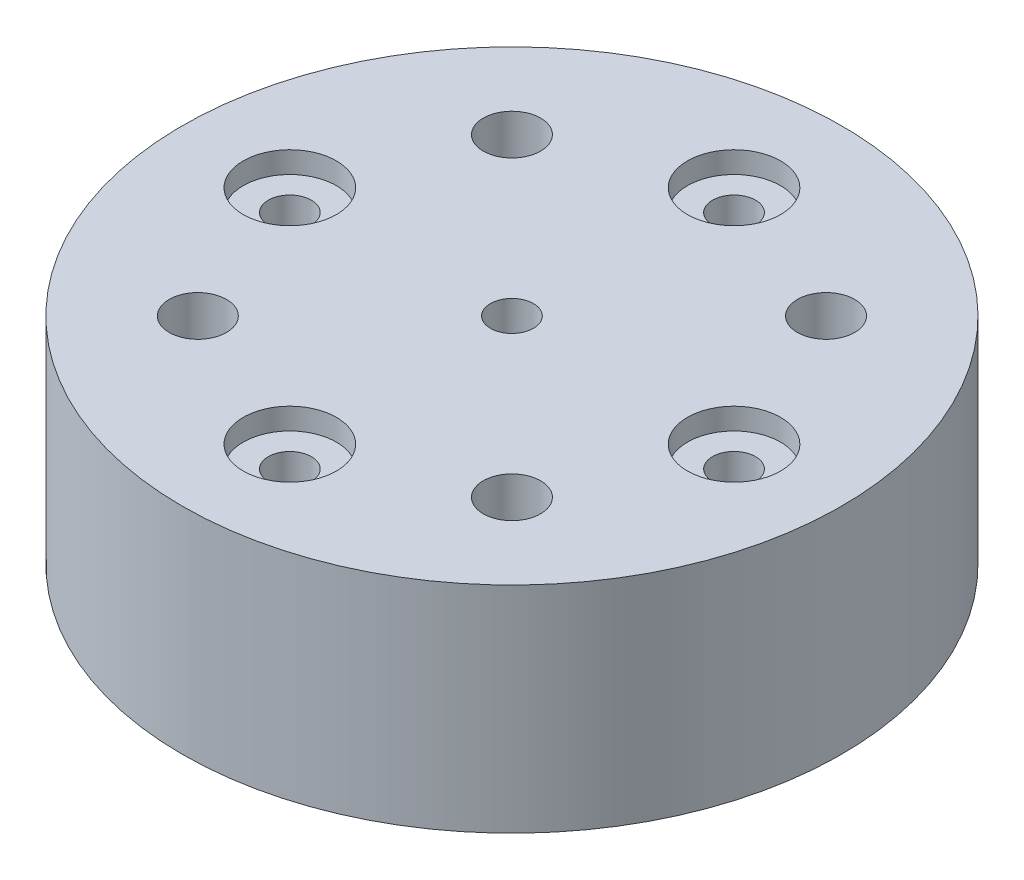
ISO-10303-21;
HEADER;
FILE_DESCRIPTION(('STEP AP214'),'2;1');
FILE_NAME('part.step','',(''),(''),'','','');
FILE_SCHEMA(('AUTOMOTIVE_DESIGN { 1 0 10303 214 1 1 1 1 }'));
ENDSEC;
DATA;
#1=APPLICATION_CONTEXT('core data for automotive mechanical design processes');
#2=APPLICATION_PROTOCOL_DEFINITION('international standard','automotive_design',2000,#1);
#3=PRODUCT_CONTEXT('',#1,'mechanical');
#4=PRODUCT('Part','Part','',(#3));
#5=PRODUCT_RELATED_PRODUCT_CATEGORY('part','',(#4));
#6=PRODUCT_DEFINITION_FORMATION('','',#4);
#7=PRODUCT_DEFINITION_CONTEXT('part definition',#1,'design');
#8=PRODUCT_DEFINITION('design','',#6,#7);
#9=PRODUCT_DEFINITION_SHAPE('','',#8);
#10=(LENGTH_UNIT() NAMED_UNIT(*) SI_UNIT(.MILLI.,.METRE.));
#11=(NAMED_UNIT(*) PLANE_ANGLE_UNIT() SI_UNIT($,.RADIAN.));
#12=(NAMED_UNIT(*) SI_UNIT($,.STERADIAN.) SOLID_ANGLE_UNIT());
#13=UNCERTAINTY_MEASURE_WITH_UNIT(LENGTH_MEASURE(1.E-05),#10,'distance_accuracy_value','');
#14=(GEOMETRIC_REPRESENTATION_CONTEXT(3) GLOBAL_UNCERTAINTY_ASSIGNED_CONTEXT((#13)) GLOBAL_UNIT_ASSIGNED_CONTEXT((#10,
#11,#12)) REPRESENTATION_CONTEXT('',''));
#15=CARTESIAN_POINT('',(0.,0.,0.));
#16=DIRECTION('',(0.,0.,1.));
#17=DIRECTION('',(1.,0.,0.));
#18=AXIS2_PLACEMENT_3D('',#15,#16,#17);
#19=CARTESIAN_POINT('',(0.,15.,-15.5));
#20=DIRECTION('',(0.,-1.,0.));
#21=DIRECTION('',(0.,0.,-1.));
#22=AXIS2_PLACEMENT_3D('',#19,#20,#21);
#23=CYLINDRICAL_SURFACE('',#22,1.5);
#24=CARTESIAN_POINT('',(0.,0.,-15.5));
#25=DIRECTION('',(0.,1.,0.));
#26=DIRECTION('',(0.,0.,1.));
#27=AXIS2_PLACEMENT_3D('',#24,#25,#26);
#28=CIRCLE('',#27,1.5);
#29=CARTESIAN_POINT('',(0.,0.,-14.));
#30=VERTEX_POINT('',#29);
#31=EDGE_CURVE('E44',#30,#30,#28,.T.);
#32=ORIENTED_EDGE('',*,*,#31,.F.);
#33=EDGE_LOOP('',(#32));
#34=FACE_BOUND('',#33,.T.);
#35=CARTESIAN_POINT('',(0.,13.5,-15.5));
#36=DIRECTION('',(0.,1.,0.));
#37=DIRECTION('',(0.,0.,1.));
#38=AXIS2_PLACEMENT_3D('',#35,#36,#37);
#39=CIRCLE('',#38,1.5);
#40=CARTESIAN_POINT('',(0.,13.5,-14.));
#41=VERTEX_POINT('',#40);
#42=EDGE_CURVE('E35',#41,#41,#39,.T.);
#43=ORIENTED_EDGE('',*,*,#42,.T.);
#44=EDGE_LOOP('',(#43));
#45=FACE_BOUND('',#44,.T.);
#46=ADVANCED_FACE('F31',(#34,#45),#23,.F.);
#47=CARTESIAN_POINT('',(15.5000000000004,15.,-4.37689192363245E-13));
#48=DIRECTION('',(0.,-1.,0.));
#49=DIRECTION('',(0.,0.,-1.));
#50=AXIS2_PLACEMENT_3D('',#47,#48,#49);
#51=CYLINDRICAL_SURFACE('',#50,1.50000000000034);
#52=CARTESIAN_POINT('',(15.5000000000004,0.,-4.37689192363245E-13));
#53=DIRECTION('',(0.,1.,0.));
#54=DIRECTION('',(0.,0.,1.));
#55=AXIS2_PLACEMENT_3D('',#52,#53,#54);
#56=CIRCLE('',#55,1.50000000000034);
#57=CARTESIAN_POINT('',(15.5000000000004,0.,1.49999999999991));
#58=VERTEX_POINT('',#57);
#59=EDGE_CURVE('E77',#58,#58,#56,.T.);
#60=ORIENTED_EDGE('',*,*,#59,.F.);
#61=EDGE_LOOP('',(#60));
#62=FACE_BOUND('',#61,.T.);
#63=CARTESIAN_POINT('',(15.5000000000004,13.5,-4.37689192363245E-13));
#64=DIRECTION('',(0.,1.,0.));
#65=DIRECTION('',(0.,0.,1.));
#66=AXIS2_PLACEMENT_3D('',#63,#64,#65);
#67=CIRCLE('',#66,1.50000000000034);
#68=CARTESIAN_POINT('',(15.5000000000004,13.5,1.49999999999991));
#69=VERTEX_POINT('',#68);
#70=EDGE_CURVE('E55',#69,#69,#67,.T.);
#71=ORIENTED_EDGE('',*,*,#70,.T.);
#72=EDGE_LOOP('',(#71));
#73=FACE_BOUND('',#72,.T.);
#74=ADVANCED_FACE('F87',(#62,#73),#51,.F.);
#75=CARTESIAN_POINT('',(8.75378384726489E-13,15.,15.5));
#76=DIRECTION('',(0.,-1.,0.));
#77=DIRECTION('',(0.,0.,-1.));
#78=AXIS2_PLACEMENT_3D('',#75,#76,#77);
#79=CYLINDRICAL_SURFACE('',#78,1.50000000000094);
#80=CARTESIAN_POINT('',(8.75378384726489E-13,0.,15.5));
#81=DIRECTION('',(0.,1.,0.));
#82=DIRECTION('',(0.,0.,1.));
#83=AXIS2_PLACEMENT_3D('',#80,#81,#82);
#84=CIRCLE('',#83,1.50000000000094);
#85=CARTESIAN_POINT('',(8.75378384726489E-13,0.,17.0000000000009));
#86=VERTEX_POINT('',#85);
#87=EDGE_CURVE('E75',#86,#86,#84,.T.);
#88=ORIENTED_EDGE('',*,*,#87,.F.);
#89=EDGE_LOOP('',(#88));
#90=FACE_BOUND('',#89,.T.);
#91=CARTESIAN_POINT('',(8.75378384726489E-13,13.5,15.5));
#92=DIRECTION('',(0.,1.,0.));
#93=DIRECTION('',(0.,0.,1.));
#94=AXIS2_PLACEMENT_3D('',#91,#92,#93);
#95=CIRCLE('',#94,1.50000000000094);
#96=CARTESIAN_POINT('',(8.75378384726489E-13,13.5,17.0000000000009));
#97=VERTEX_POINT('',#96);
#98=EDGE_CURVE('E52',#97,#97,#95,.T.);
#99=ORIENTED_EDGE('',*,*,#98,.T.);
#100=EDGE_LOOP('',(#99));
#101=FACE_BOUND('',#100,.T.);
#102=ADVANCED_FACE('F92',(#90,#101),#79,.F.);
#103=CARTESIAN_POINT('',(-15.4999999999996,15.,4.39587394901923E-13));
#104=DIRECTION('',(0.,-1.,0.));
#105=DIRECTION('',(0.,0.,-1.));
#106=AXIS2_PLACEMENT_3D('',#103,#104,#105);
#107=CYLINDRICAL_SURFACE('',#106,1.5000000000007);
#108=CARTESIAN_POINT('',(-15.4999999999996,0.,4.39587394901923E-13));
#109=DIRECTION('',(0.,1.,0.));
#110=DIRECTION('',(0.,0.,1.));
#111=AXIS2_PLACEMENT_3D('',#108,#109,#110);
#112=CIRCLE('',#111,1.5000000000007);
#113=CARTESIAN_POINT('',(-15.4999999999996,0.,1.50000000000114));
#114=VERTEX_POINT('',#113);
#115=EDGE_CURVE('E69',#114,#114,#112,.T.);
#116=ORIENTED_EDGE('',*,*,#115,.F.);
#117=EDGE_LOOP('',(#116));
#118=FACE_BOUND('',#117,.T.);
#119=CARTESIAN_POINT('',(-15.4999999999996,13.5,4.39587394901923E-13));
#120=DIRECTION('',(0.,1.,0.));
#121=DIRECTION('',(0.,0.,1.));
#122=AXIS2_PLACEMENT_3D('',#119,#120,#121);
#123=CIRCLE('',#122,1.5000000000007);
#124=CARTESIAN_POINT('',(-15.4999999999996,13.5,1.50000000000114));
#125=VERTEX_POINT('',#124);
#126=EDGE_CURVE('E49',#125,#125,#123,.T.);
#127=ORIENTED_EDGE('',*,*,#126,.T.);
#128=EDGE_LOOP('',(#127));
#129=FACE_BOUND('',#128,.T.);
#130=ADVANCED_FACE('F99',(#118,#129),#107,.F.);
#131=CARTESIAN_POINT('',(0.,15.,0.));
#132=DIRECTION('',(0.,1.,0.));
#133=DIRECTION('',(0.,0.,1.));
#134=AXIS2_PLACEMENT_3D('',#131,#132,#133);
#135=PLANE('',#134);
#136=CARTESIAN_POINT('',(-10.9601551083912,15.,10.9601551083918));
#137=DIRECTION('',(0.,1.,0.));
#138=DIRECTION('',(0.,0.,1.));
#139=AXIS2_PLACEMENT_3D('',#136,#137,#138);
#140=CIRCLE('',#139,2.00000000000033);
#141=CARTESIAN_POINT('',(-10.9601551083912,15.,12.9601551083921));
#142=VERTEX_POINT('',#141);
#143=EDGE_CURVE('E171',#142,#142,#140,.T.);
#144=ORIENTED_EDGE('',*,*,#143,.F.);
#145=EDGE_LOOP('',(#144));
#146=FACE_BOUND('',#145,.T.);
#147=CARTESIAN_POINT('',(10.9601551083924,15.,10.9601551083912));
#148=DIRECTION('',(0.,1.,0.));
#149=DIRECTION('',(0.,0.,1.));
#150=AXIS2_PLACEMENT_3D('',#147,#148,#149);
#151=CIRCLE('',#150,2.00000000000086);
#152=CARTESIAN_POINT('',(10.9601551083924,15.,12.9601551083921));
#153=VERTEX_POINT('',#152);
#154=EDGE_CURVE('E254',#153,#153,#151,.T.);
#155=ORIENTED_EDGE('',*,*,#154,.F.);
#156=EDGE_LOOP('',(#155));
#157=FACE_BOUND('',#156,.T.);
#158=CARTESIAN_POINT('',(10.9601551083918,15.,-10.9601551083924));
#159=DIRECTION('',(0.,1.,0.));
#160=DIRECTION('',(0.,0.,1.));
#161=AXIS2_PLACEMENT_3D('',#158,#159,#160);
#162=CIRCLE('',#161,2.00000000000063);
#163=CARTESIAN_POINT('',(10.9601551083918,15.,-8.96015510839176));
#164=VERTEX_POINT('',#163);
#165=EDGE_CURVE('E246',#164,#164,#162,.T.);
#166=ORIENTED_EDGE('',*,*,#165,.F.);
#167=EDGE_LOOP('',(#166));
#168=FACE_BOUND('',#167,.T.);
#169=CARTESIAN_POINT('',(-10.9601551083918,15.,-10.9601551083918));
#170=DIRECTION('',(0.,1.,0.));
#171=DIRECTION('',(0.,0.,1.));
#172=AXIS2_PLACEMENT_3D('',#169,#170,#171);
#173=CIRCLE('',#172,2.);
#174=CARTESIAN_POINT('',(-10.9601551083918,15.,-8.96015510839181));
#175=VERTEX_POINT('',#174);
#176=EDGE_CURVE('E163',#175,#175,#173,.T.);
#177=ORIENTED_EDGE('',*,*,#176,.F.);
#178=EDGE_LOOP('',(#177));
#179=FACE_BOUND('',#178,.T.);
#180=CARTESIAN_POINT('',(0.,15.,-15.5000000000004));
#181=DIRECTION('',(0.,1.,0.));
#182=DIRECTION('',(0.,0.,1.));
#183=AXIS2_PLACEMENT_3D('',#180,#181,#182);
#184=CIRCLE('',#183,3.25);
#185=CARTESIAN_POINT('',(0.,15.,-12.2500000000004));
#186=VERTEX_POINT('',#185);
#187=EDGE_CURVE('E176',#186,#186,#184,.T.);
#188=ORIENTED_EDGE('',*,*,#187,.F.);
#189=EDGE_LOOP('',(#188));
#190=FACE_BOUND('',#189,.T.);
#191=CARTESIAN_POINT('',(15.5000000000009,15.,-4.37689192363257E-13));
#192=DIRECTION('',(0.,1.,0.));
#193=DIRECTION('',(0.,0.,1.));
#194=AXIS2_PLACEMENT_3D('',#191,#192,#193);
#195=CIRCLE('',#194,3.25000000000034);
#196=CARTESIAN_POINT('',(15.5000000000009,15.,3.2499999999999));
#197=VERTEX_POINT('',#196);
#198=EDGE_CURVE('E145',#197,#197,#195,.T.);
#199=ORIENTED_EDGE('',*,*,#198,.F.);
#200=EDGE_LOOP('',(#199));
#201=FACE_BOUND('',#200,.T.);
#202=CARTESIAN_POINT('',(8.75378384726514E-13,15.,15.5000000000004));
#203=DIRECTION('',(0.,1.,0.));
#204=DIRECTION('',(0.,0.,1.));
#205=AXIS2_PLACEMENT_3D('',#202,#203,#204);
#206=CIRCLE('',#205,3.25000000000094);
#207=CARTESIAN_POINT('',(8.75378384726514E-13,15.,18.7500000000014));
#208=VERTEX_POINT('',#207);
#209=EDGE_CURVE('E146',#208,#208,#206,.T.);
#210=ORIENTED_EDGE('',*,*,#209,.F.);
#211=EDGE_LOOP('',(#210));
#212=FACE_BOUND('',#211,.T.);
#213=CARTESIAN_POINT('',(-15.5,15.,4.39587394901935E-13));
#214=DIRECTION('',(0.,1.,0.));
#215=DIRECTION('',(0.,0.,1.));
#216=AXIS2_PLACEMENT_3D('',#213,#214,#215);
#217=CIRCLE('',#216,3.2500000000007);
#218=CARTESIAN_POINT('',(-15.5,15.,3.25000000000114));
#219=VERTEX_POINT('',#218);
#220=EDGE_CURVE('E157',#219,#219,#217,.T.);
#221=ORIENTED_EDGE('',*,*,#220,.F.);
#222=EDGE_LOOP('',(#221));
#223=FACE_BOUND('',#222,.T.);
#224=CARTESIAN_POINT('',(0.,15.,0.));
#225=DIRECTION('',(0.,1.,0.));
#226=DIRECTION('',(0.,0.,1.));
#227=AXIS2_PLACEMENT_3D('',#224,#225,#226);
#228=CIRCLE('',#227,23.);
#229=CARTESIAN_POINT('',(0.,15.,23.));
#230=VERTEX_POINT('',#229);
#231=EDGE_CURVE('E10',#230,#230,#228,.T.);
#232=ORIENTED_EDGE('',*,*,#231,.T.);
#233=EDGE_LOOP('',(#232));
#234=FACE_BOUND('',#233,.T.);
#235=CARTESIAN_POINT('',(0.,15.,0.));
#236=DIRECTION('',(0.,1.,0.));
#237=DIRECTION('',(0.,0.,1.));
#238=AXIS2_PLACEMENT_3D('',#235,#236,#237);
#239=CIRCLE('',#238,1.5);
#240=CARTESIAN_POINT('',(0.,15.,1.5));
#241=VERTEX_POINT('',#240);
#242=EDGE_CURVE('E64',#241,#241,#239,.T.);
#243=ORIENTED_EDGE('',*,*,#242,.F.);
#244=EDGE_LOOP('',(#243));
#245=FACE_BOUND('',#244,.T.);
#246=ADVANCED_FACE('F97',(#146,#157,#168,#179,#190,#201,#212,#223,#234,#245),#135,.T.);
#247=CARTESIAN_POINT('',(0.,0.,0.));
#248=DIRECTION('',(0.,1.,0.));
#249=DIRECTION('',(0.,0.,1.));
#250=AXIS2_PLACEMENT_3D('',#247,#248,#249);
#251=PLANE('',#250);
#252=CARTESIAN_POINT('',(0.,0.,0.));
#253=DIRECTION('',(0.,1.,0.));
#254=DIRECTION('',(0.,0.,1.));
#255=AXIS2_PLACEMENT_3D('',#252,#253,#254);
#256=CIRCLE('',#255,23.);
#257=CARTESIAN_POINT('',(0.,0.,23.));
#258=VERTEX_POINT('',#257);
#259=EDGE_CURVE('E39',#258,#258,#256,.T.);
#260=ORIENTED_EDGE('',*,*,#259,.F.);
#261=EDGE_LOOP('',(#260));
#262=FACE_BOUND('',#261,.T.);
#263=ORIENTED_EDGE('',*,*,#31,.T.);
#264=EDGE_LOOP('',(#263));
#265=FACE_BOUND('',#264,.T.);
#266=ORIENTED_EDGE('',*,*,#59,.T.);
#267=EDGE_LOOP('',(#266));
#268=FACE_BOUND('',#267,.T.);
#269=ORIENTED_EDGE('',*,*,#87,.T.);
#270=EDGE_LOOP('',(#269));
#271=FACE_BOUND('',#270,.T.);
#272=ORIENTED_EDGE('',*,*,#115,.T.);
#273=EDGE_LOOP('',(#272));
#274=FACE_BOUND('',#273,.T.);
#275=CARTESIAN_POINT('',(0.,0.,0.));
#276=DIRECTION('',(0.,1.,0.));
#277=DIRECTION('',(0.,0.,1.));
#278=AXIS2_PLACEMENT_3D('',#275,#276,#277);
#279=CIRCLE('',#278,1.5);
#280=CARTESIAN_POINT('',(0.,0.,1.5));
#281=VERTEX_POINT('',#280);
#282=EDGE_CURVE('E60',#281,#281,#279,.T.);
#283=ORIENTED_EDGE('',*,*,#282,.T.);
#284=EDGE_LOOP('',(#283));
#285=FACE_BOUND('',#284,.T.);
#286=ADVANCED_FACE('F84',(#262,#265,#268,#271,#274,#285),#251,.F.);
#287=CARTESIAN_POINT('',(0.,15.,0.));
#288=DIRECTION('',(0.,-1.,0.));
#289=DIRECTION('',(0.,0.,-1.));
#290=AXIS2_PLACEMENT_3D('',#287,#288,#289);
#291=CYLINDRICAL_SURFACE('',#290,23.);
#292=ORIENTED_EDGE('',*,*,#231,.F.);
#293=EDGE_LOOP('',(#292));
#294=FACE_BOUND('',#293,.T.);
#295=ORIENTED_EDGE('',*,*,#259,.T.);
#296=EDGE_LOOP('',(#295));
#297=FACE_BOUND('',#296,.T.);
#298=ADVANCED_FACE('F33',(#294,#297),#291,.T.);
#299=CARTESIAN_POINT('',(0.,15.,0.));
#300=DIRECTION('',(0.,-1.,0.));
#301=DIRECTION('',(0.,0.,-1.));
#302=AXIS2_PLACEMENT_3D('',#299,#300,#301);
#303=CYLINDRICAL_SURFACE('',#302,1.5);
#304=ORIENTED_EDGE('',*,*,#242,.T.);
#305=EDGE_LOOP('',(#304));
#306=FACE_BOUND('',#305,.T.);
#307=ORIENTED_EDGE('',*,*,#282,.F.);
#308=EDGE_LOOP('',(#307));
#309=FACE_BOUND('',#308,.T.);
#310=ADVANCED_FACE('F106',(#306,#309),#303,.F.);
#311=CARTESIAN_POINT('',(-15.5,13.5,4.39587394901935E-13));
#312=DIRECTION('',(0.,1.,0.));
#313=DIRECTION('',(0.,0.,1.));
#314=AXIS2_PLACEMENT_3D('',#311,#312,#313);
#315=CYLINDRICAL_SURFACE('',#314,3.2500000000007);
#316=CARTESIAN_POINT('',(-15.5,13.5,4.39587394901935E-13));
#317=DIRECTION('',(0.,1.,0.));
#318=DIRECTION('',(0.,0.,1.));
#319=AXIS2_PLACEMENT_3D('',#316,#317,#318);
#320=CIRCLE('',#319,3.2500000000007);
#321=CARTESIAN_POINT('',(-15.5,13.5,3.25000000000114));
#322=VERTEX_POINT('',#321);
#323=EDGE_CURVE('E152',#322,#322,#320,.T.);
#324=ORIENTED_EDGE('',*,*,#323,.F.);
#325=EDGE_LOOP('',(#324));
#326=FACE_BOUND('',#325,.T.);
#327=ORIENTED_EDGE('',*,*,#220,.T.);
#328=EDGE_LOOP('',(#327));
#329=FACE_BOUND('',#328,.T.);
#330=ADVANCED_FACE('F113',(#326,#329),#315,.F.);
#331=CARTESIAN_POINT('',(-15.5,13.5,4.39587394901935E-13));
#332=DIRECTION('',(0.,1.,0.));
#333=DIRECTION('',(0.,0.,1.));
#334=AXIS2_PLACEMENT_3D('',#331,#332,#333);
#335=PLANE('',#334);
#336=ORIENTED_EDGE('',*,*,#126,.F.);
#337=EDGE_LOOP('',(#336));
#338=FACE_BOUND('',#337,.T.);
#339=ORIENTED_EDGE('',*,*,#323,.T.);
#340=EDGE_LOOP('',(#339));
#341=FACE_BOUND('',#340,.T.);
#342=ADVANCED_FACE('F119',(#338,#341),#335,.T.);
#343=CARTESIAN_POINT('',(8.75378384726514E-13,13.5,15.5000000000004));
#344=DIRECTION('',(0.,1.,0.));
#345=DIRECTION('',(0.,0.,1.));
#346=AXIS2_PLACEMENT_3D('',#343,#344,#345);
#347=CYLINDRICAL_SURFACE('',#346,3.25000000000094);
#348=CARTESIAN_POINT('',(8.75378384726514E-13,13.5,15.5000000000004));
#349=DIRECTION('',(0.,1.,0.));
#350=DIRECTION('',(0.,0.,1.));
#351=AXIS2_PLACEMENT_3D('',#348,#349,#350);
#352=CIRCLE('',#351,3.25000000000094);
#353=CARTESIAN_POINT('',(8.75378384726514E-13,13.5,18.7500000000014));
#354=VERTEX_POINT('',#353);
#355=EDGE_CURVE('E143',#354,#354,#352,.T.);
#356=ORIENTED_EDGE('',*,*,#355,.F.);
#357=EDGE_LOOP('',(#356));
#358=FACE_BOUND('',#357,.T.);
#359=ORIENTED_EDGE('',*,*,#209,.T.);
#360=EDGE_LOOP('',(#359));
#361=FACE_BOUND('',#360,.T.);
#362=ADVANCED_FACE('F139',(#358,#361),#347,.F.);
#363=CARTESIAN_POINT('',(8.75378384726514E-13,13.5,15.5000000000004));
#364=DIRECTION('',(0.,1.,0.));
#365=DIRECTION('',(0.,0.,1.));
#366=AXIS2_PLACEMENT_3D('',#363,#364,#365);
#367=PLANE('',#366);
#368=ORIENTED_EDGE('',*,*,#98,.F.);
#369=EDGE_LOOP('',(#368));
#370=FACE_BOUND('',#369,.T.);
#371=ORIENTED_EDGE('',*,*,#355,.T.);
#372=EDGE_LOOP('',(#371));
#373=FACE_BOUND('',#372,.T.);
#374=ADVANCED_FACE('F135',(#370,#373),#367,.T.);
#375=CARTESIAN_POINT('',(15.5000000000009,13.5,-4.37689192363257E-13));
#376=DIRECTION('',(0.,1.,0.));
#377=DIRECTION('',(0.,0.,1.));
#378=AXIS2_PLACEMENT_3D('',#375,#376,#377);
#379=CYLINDRICAL_SURFACE('',#378,3.25000000000034);
#380=CARTESIAN_POINT('',(15.5000000000009,13.5,-4.37689192363257E-13));
#381=DIRECTION('',(0.,1.,0.));
#382=DIRECTION('',(0.,0.,1.));
#383=AXIS2_PLACEMENT_3D('',#380,#381,#382);
#384=CIRCLE('',#383,3.25000000000034);
#385=CARTESIAN_POINT('',(15.5000000000009,13.5,3.2499999999999));
#386=VERTEX_POINT('',#385);
#387=EDGE_CURVE('E149',#386,#386,#384,.T.);
#388=ORIENTED_EDGE('',*,*,#387,.F.);
#389=EDGE_LOOP('',(#388));
#390=FACE_BOUND('',#389,.T.);
#391=ORIENTED_EDGE('',*,*,#198,.T.);
#392=EDGE_LOOP('',(#391));
#393=FACE_BOUND('',#392,.T.);
#394=ADVANCED_FACE('F138',(#390,#393),#379,.F.);
#395=CARTESIAN_POINT('',(15.5000000000009,13.5,-4.37689192363257E-13));
#396=DIRECTION('',(0.,1.,0.));
#397=DIRECTION('',(0.,0.,1.));
#398=AXIS2_PLACEMENT_3D('',#395,#396,#397);
#399=PLANE('',#398);
#400=ORIENTED_EDGE('',*,*,#70,.F.);
#401=EDGE_LOOP('',(#400));
#402=FACE_BOUND('',#401,.T.);
#403=ORIENTED_EDGE('',*,*,#387,.T.);
#404=EDGE_LOOP('',(#403));
#405=FACE_BOUND('',#404,.T.);
#406=ADVANCED_FACE('F181',(#402,#405),#399,.T.);
#407=CARTESIAN_POINT('',(0.,13.5,-15.5000000000004));
#408=DIRECTION('',(0.,1.,0.));
#409=DIRECTION('',(0.,0.,1.));
#410=AXIS2_PLACEMENT_3D('',#407,#408,#409);
#411=CYLINDRICAL_SURFACE('',#410,3.25);
#412=CARTESIAN_POINT('',(0.,13.5,-15.5000000000004));
#413=DIRECTION('',(0.,1.,0.));
#414=DIRECTION('',(0.,0.,1.));
#415=AXIS2_PLACEMENT_3D('',#412,#413,#414);
#416=CIRCLE('',#415,3.25);
#417=CARTESIAN_POINT('',(0.,13.5,-12.2500000000004));
#418=VERTEX_POINT('',#417);
#419=EDGE_CURVE('E53',#418,#418,#416,.T.);
#420=ORIENTED_EDGE('',*,*,#419,.F.);
#421=EDGE_LOOP('',(#420));
#422=FACE_BOUND('',#421,.T.);
#423=ORIENTED_EDGE('',*,*,#187,.T.);
#424=EDGE_LOOP('',(#423));
#425=FACE_BOUND('',#424,.T.);
#426=ADVANCED_FACE('F203',(#422,#425),#411,.F.);
#427=CARTESIAN_POINT('',(0.,13.5,-15.5000000000004));
#428=DIRECTION('',(0.,1.,0.));
#429=DIRECTION('',(0.,0.,1.));
#430=AXIS2_PLACEMENT_3D('',#427,#428,#429);
#431=PLANE('',#430);
#432=ORIENTED_EDGE('',*,*,#42,.F.);
#433=EDGE_LOOP('',(#432));
#434=FACE_BOUND('',#433,.T.);
#435=ORIENTED_EDGE('',*,*,#419,.T.);
#436=EDGE_LOOP('',(#435));
#437=FACE_BOUND('',#436,.T.);
#438=ADVANCED_FACE('F207',(#434,#437),#431,.T.);
#439=CARTESIAN_POINT('',(-10.9601551083918,5.,-10.9601551083918));
#440=DIRECTION('',(0.,1.,0.));
#441=DIRECTION('',(0.,0.,1.));
#442=AXIS2_PLACEMENT_3D('',#439,#440,#441);
#443=CYLINDRICAL_SURFACE('',#442,2.);
#444=CARTESIAN_POINT('',(-10.9601551083918,5.,-10.9601551083918));
#445=DIRECTION('',(0.,1.,0.));
#446=DIRECTION('',(0.,0.,1.));
#447=AXIS2_PLACEMENT_3D('',#444,#445,#446);
#448=CIRCLE('',#447,2.);
#449=CARTESIAN_POINT('',(-10.9601551083918,5.,-8.96015510839181));
#450=VERTEX_POINT('',#449);
#451=EDGE_CURVE('E159',#450,#450,#448,.T.);
#452=ORIENTED_EDGE('',*,*,#451,.F.);
#453=EDGE_LOOP('',(#452));
#454=FACE_BOUND('',#453,.T.);
#455=ORIENTED_EDGE('',*,*,#176,.T.);
#456=EDGE_LOOP('',(#455));
#457=FACE_BOUND('',#456,.T.);
#458=ADVANCED_FACE('F211',(#454,#457),#443,.F.);
#459=CARTESIAN_POINT('',(-10.9601551083918,5.,-10.9601551083918));
#460=DIRECTION('',(0.,1.,0.));
#461=DIRECTION('',(0.,0.,1.));
#462=AXIS2_PLACEMENT_3D('',#459,#460,#461);
#463=PLANE('',#462);
#464=ORIENTED_EDGE('',*,*,#451,.T.);
#465=EDGE_LOOP('',(#464));
#466=FACE_BOUND('',#465,.T.);
#467=ADVANCED_FACE('F215',(#466),#463,.T.);
#468=CARTESIAN_POINT('',(10.9601551083918,5.,-10.9601551083924));
#469=DIRECTION('',(0.,1.,0.));
#470=DIRECTION('',(0.,0.,1.));
#471=AXIS2_PLACEMENT_3D('',#468,#469,#470);
#472=CYLINDRICAL_SURFACE('',#471,2.00000000000063);
#473=CARTESIAN_POINT('',(10.9601551083918,5.,-10.9601551083924));
#474=DIRECTION('',(0.,1.,0.));
#475=DIRECTION('',(0.,0.,1.));
#476=AXIS2_PLACEMENT_3D('',#473,#474,#475);
#477=CIRCLE('',#476,2.00000000000063);
#478=CARTESIAN_POINT('',(10.9601551083918,5.,-8.96015510839176));
#479=VERTEX_POINT('',#478);
#480=EDGE_CURVE('E168',#479,#479,#477,.T.);
#481=ORIENTED_EDGE('',*,*,#480,.F.);
#482=EDGE_LOOP('',(#481));
#483=FACE_BOUND('',#482,.T.);
#484=ORIENTED_EDGE('',*,*,#165,.T.);
#485=EDGE_LOOP('',(#484));
#486=FACE_BOUND('',#485,.T.);
#487=ADVANCED_FACE('F219',(#483,#486),#472,.F.);
#488=CARTESIAN_POINT('',(10.9601551083918,5.,-10.9601551083924));
#489=DIRECTION('',(0.,1.,0.));
#490=DIRECTION('',(0.,0.,1.));
#491=AXIS2_PLACEMENT_3D('',#488,#489,#490);
#492=PLANE('',#491);
#493=ORIENTED_EDGE('',*,*,#480,.T.);
#494=EDGE_LOOP('',(#493));
#495=FACE_BOUND('',#494,.T.);
#496=ADVANCED_FACE('F232',(#495),#492,.T.);
#497=CARTESIAN_POINT('',(10.9601551083924,5.,10.9601551083912));
#498=DIRECTION('',(0.,1.,0.));
#499=DIRECTION('',(0.,0.,1.));
#500=AXIS2_PLACEMENT_3D('',#497,#498,#499);
#501=CYLINDRICAL_SURFACE('',#500,2.00000000000086);
#502=CARTESIAN_POINT('',(10.9601551083924,5.,10.9601551083912));
#503=DIRECTION('',(0.,1.,0.));
#504=DIRECTION('',(0.,0.,1.));
#505=AXIS2_PLACEMENT_3D('',#502,#503,#504);
#506=CIRCLE('',#505,2.00000000000086);
#507=CARTESIAN_POINT('',(10.9601551083924,5.,12.9601551083921));
#508=VERTEX_POINT('',#507);
#509=EDGE_CURVE('E249',#508,#508,#506,.T.);
#510=ORIENTED_EDGE('',*,*,#509,.F.);
#511=EDGE_LOOP('',(#510));
#512=FACE_BOUND('',#511,.T.);
#513=ORIENTED_EDGE('',*,*,#154,.T.);
#514=EDGE_LOOP('',(#513));
#515=FACE_BOUND('',#514,.T.);
#516=ADVANCED_FACE('F229',(#512,#515),#501,.F.);
#517=CARTESIAN_POINT('',(10.9601551083924,5.,10.9601551083912));
#518=DIRECTION('',(0.,1.,0.));
#519=DIRECTION('',(0.,0.,1.));
#520=AXIS2_PLACEMENT_3D('',#517,#518,#519);
#521=PLANE('',#520);
#522=ORIENTED_EDGE('',*,*,#509,.T.);
#523=EDGE_LOOP('',(#522));
#524=FACE_BOUND('',#523,.T.);
#525=ADVANCED_FACE('F224',(#524),#521,.T.);
#526=CARTESIAN_POINT('',(-10.9601551083912,5.,10.9601551083918));
#527=DIRECTION('',(0.,1.,0.));
#528=DIRECTION('',(0.,0.,1.));
#529=AXIS2_PLACEMENT_3D('',#526,#527,#528);
#530=CYLINDRICAL_SURFACE('',#529,2.00000000000033);
#531=CARTESIAN_POINT('',(-10.9601551083912,5.,10.9601551083918));
#532=DIRECTION('',(0.,1.,0.));
#533=DIRECTION('',(0.,0.,1.));
#534=AXIS2_PLACEMENT_3D('',#531,#532,#533);
#535=CIRCLE('',#534,2.00000000000033);
#536=CARTESIAN_POINT('',(-10.9601551083912,5.,12.9601551083921));
#537=VERTEX_POINT('',#536);
#538=EDGE_CURVE('E256',#537,#537,#535,.T.);
#539=ORIENTED_EDGE('',*,*,#538,.F.);
#540=EDGE_LOOP('',(#539));
#541=FACE_BOUND('',#540,.T.);
#542=ORIENTED_EDGE('',*,*,#143,.T.);
#543=EDGE_LOOP('',(#542));
#544=FACE_BOUND('',#543,.T.);
#545=ADVANCED_FACE('F220',(#541,#544),#530,.F.);
#546=CARTESIAN_POINT('',(-10.9601551083912,5.,10.9601551083918));
#547=DIRECTION('',(0.,1.,0.));
#548=DIRECTION('',(0.,0.,1.));
#549=AXIS2_PLACEMENT_3D('',#546,#547,#548);
#550=PLANE('',#549);
#551=ORIENTED_EDGE('',*,*,#538,.T.);
#552=EDGE_LOOP('',(#551));
#553=FACE_BOUND('',#552,.T.);
#554=ADVANCED_FACE('F223',(#553),#550,.T.);
#555=CLOSED_SHELL('',(#46,#74,#102,#130,#246,#286,#298,#310,#330,#342,#362,#374,#394,#406,#426,
#438,#458,#467,#487,#496,#516,#525,#545,#554));
#556=MANIFOLD_SOLID_BREP('B2',#555);
#557=ADVANCED_BREP_SHAPE_REPRESENTATION('',(#18,#556),#14);
#558=SHAPE_DEFINITION_REPRESENTATION(#9,#557);
ENDSEC;
END-ISO-10303-21;
